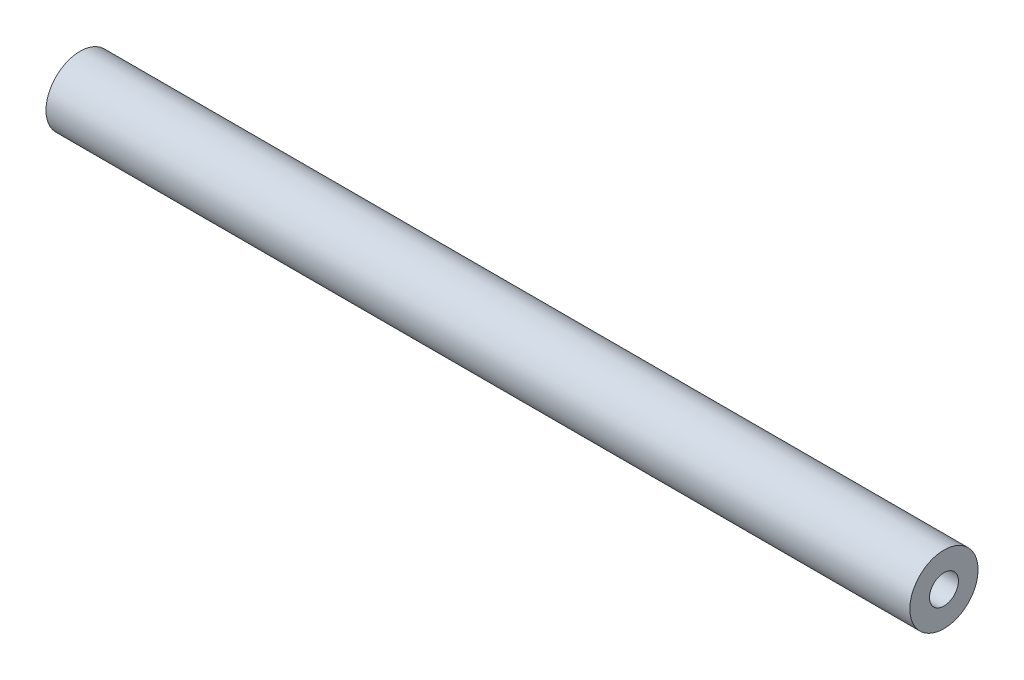
ISO-10303-21;
HEADER;
FILE_DESCRIPTION(('STEP AP214'),'2;1');
FILE_NAME('part.step','',(''),(''),'','','');
FILE_SCHEMA(('AUTOMOTIVE_DESIGN { 1 0 10303 214 1 1 1 1 }'));
ENDSEC;
DATA;
#1=APPLICATION_CONTEXT('core data for automotive mechanical design processes');
#2=APPLICATION_PROTOCOL_DEFINITION('international standard','automotive_design',2000,#1);
#3=PRODUCT_CONTEXT('',#1,'mechanical');
#4=PRODUCT('Part','Part','',(#3));
#5=PRODUCT_RELATED_PRODUCT_CATEGORY('part','',(#4));
#6=PRODUCT_DEFINITION_FORMATION('','',#4);
#7=PRODUCT_DEFINITION_CONTEXT('part definition',#1,'design');
#8=PRODUCT_DEFINITION('design','',#6,#7);
#9=PRODUCT_DEFINITION_SHAPE('','',#8);
#10=(LENGTH_UNIT() NAMED_UNIT(*) SI_UNIT(.MILLI.,.METRE.));
#11=(NAMED_UNIT(*) PLANE_ANGLE_UNIT() SI_UNIT($,.RADIAN.));
#12=(NAMED_UNIT(*) SI_UNIT($,.STERADIAN.) SOLID_ANGLE_UNIT());
#13=UNCERTAINTY_MEASURE_WITH_UNIT(LENGTH_MEASURE(1.E-05),#10,'distance_accuracy_value','');
#14=(GEOMETRIC_REPRESENTATION_CONTEXT(3) GLOBAL_UNCERTAINTY_ASSIGNED_CONTEXT((#13)) GLOBAL_UNIT_ASSIGNED_CONTEXT((#10,
#11,#12)) REPRESENTATION_CONTEXT('',''));
#15=CARTESIAN_POINT('',(0.,0.,0.));
#16=DIRECTION('',(0.,0.,1.));
#17=DIRECTION('',(1.,0.,0.));
#18=AXIS2_PLACEMENT_3D('',#15,#16,#17);
#19=CARTESIAN_POINT('',(60.325,0.,0.));
#20=DIRECTION('',(-1.,0.,0.));
#21=DIRECTION('',(0.,0.,1.));
#22=AXIS2_PLACEMENT_3D('',#19,#20,#21);
#23=CYLINDRICAL_SURFACE('',#22,4.7625);
#24=CARTESIAN_POINT('',(60.325,0.,0.));
#25=DIRECTION('',(1.,0.,0.));
#26=DIRECTION('',(0.,0.,-1.));
#27=AXIS2_PLACEMENT_3D('',#24,#25,#26);
#28=CIRCLE('',#27,4.7625);
#29=CARTESIAN_POINT('',(60.325,0.,4.7625));
#30=VERTEX_POINT('',#29);
#31=EDGE_CURVE('E11',#30,#30,#28,.T.);
#32=CARTESIAN_POINT('',(-60.325,0.,0.));
#33=DIRECTION('',(1.,0.,0.));
#34=DIRECTION('',(0.,0.,-1.));
#35=AXIS2_PLACEMENT_3D('',#32,#33,#34);
#36=CIRCLE('',#35,4.7625);
#37=CARTESIAN_POINT('',(-60.325,0.,4.7625));
#38=VERTEX_POINT('',#37);
#39=EDGE_CURVE('E48',#38,#38,#36,.T.);
#40=CARTESIAN_POINT('',(60.325,0.,4.7625));
#41=CARTESIAN_POINT('',(59.0682291666667,0.,4.7625));
#42=CARTESIAN_POINT('',(57.8114583333333,0.,4.7625));
#43=CARTESIAN_POINT('',(55.2979166666667,0.,4.7625));
#44=CARTESIAN_POINT('',(54.0411458333333,0.,4.7625));
#45=CARTESIAN_POINT('',(51.5276041666667,0.,4.7625));
#46=CARTESIAN_POINT('',(50.2708333333333,0.,4.7625));
#47=CARTESIAN_POINT('',(47.7572916666667,0.,4.7625));
#48=CARTESIAN_POINT('',(46.5005208333333,0.,4.7625));
#49=CARTESIAN_POINT('',(43.9869791666667,0.,4.7625));
#50=CARTESIAN_POINT('',(42.7302083333333,0.,4.7625));
#51=CARTESIAN_POINT('',(40.2166666666667,0.,4.7625));
#52=CARTESIAN_POINT('',(38.9598958333333,0.,4.7625));
#53=CARTESIAN_POINT('',(36.4463541666667,0.,4.7625));
#54=CARTESIAN_POINT('',(35.1895833333333,0.,4.7625));
#55=CARTESIAN_POINT('',(32.6760416666667,0.,4.7625));
#56=CARTESIAN_POINT('',(31.4192708333333,0.,4.7625));
#57=CARTESIAN_POINT('',(28.9057291666667,0.,4.7625));
#58=CARTESIAN_POINT('',(27.6489583333333,0.,4.7625));
#59=CARTESIAN_POINT('',(25.1354166666667,0.,4.7625));
#60=CARTESIAN_POINT('',(23.8786458333333,0.,4.7625));
#61=CARTESIAN_POINT('',(21.3651041666667,0.,4.7625));
#62=CARTESIAN_POINT('',(20.1083333333333,0.,4.7625));
#63=CARTESIAN_POINT('',(17.5947916666667,0.,4.7625));
#64=CARTESIAN_POINT('',(16.3380208333333,0.,4.7625));
#65=CARTESIAN_POINT('',(13.8244791666667,0.,4.7625));
#66=CARTESIAN_POINT('',(12.5677083333333,0.,4.7625));
#67=CARTESIAN_POINT('',(10.0541666666667,0.,4.7625));
#68=CARTESIAN_POINT('',(8.79739583333333,0.,4.7625));
#69=CARTESIAN_POINT('',(6.28385416666666,0.,4.7625));
#70=CARTESIAN_POINT('',(5.02708333333333,0.,4.7625));
#71=CARTESIAN_POINT('',(2.51354166666666,0.,4.7625));
#72=CARTESIAN_POINT('',(1.25677083333333,0.,4.7625));
#73=CARTESIAN_POINT('',(-1.25677083333333,0.,4.7625));
#74=CARTESIAN_POINT('',(-2.51354166666666,0.,4.7625));
#75=CARTESIAN_POINT('',(-5.02708333333332,0.,4.7625));
#76=CARTESIAN_POINT('',(-6.28385416666666,0.,4.7625));
#77=CARTESIAN_POINT('',(-8.79739583333333,0.,4.7625));
#78=CARTESIAN_POINT('',(-10.0541666666667,0.,4.7625));
#79=CARTESIAN_POINT('',(-12.5677083333333,0.,4.7625));
#80=CARTESIAN_POINT('',(-13.8244791666667,0.,4.7625));
#81=CARTESIAN_POINT('',(-16.3380208333333,0.,4.7625));
#82=CARTESIAN_POINT('',(-17.5947916666667,0.,4.7625));
#83=CARTESIAN_POINT('',(-20.1083333333333,0.,4.7625));
#84=CARTESIAN_POINT('',(-21.3651041666667,0.,4.7625));
#85=CARTESIAN_POINT('',(-23.8786458333333,0.,4.7625));
#86=CARTESIAN_POINT('',(-25.1354166666667,0.,4.7625));
#87=CARTESIAN_POINT('',(-27.6489583333333,0.,4.7625));
#88=CARTESIAN_POINT('',(-28.9057291666667,0.,4.7625));
#89=CARTESIAN_POINT('',(-31.4192708333333,0.,4.7625));
#90=CARTESIAN_POINT('',(-32.6760416666667,0.,4.7625));
#91=CARTESIAN_POINT('',(-35.1895833333333,0.,4.7625));
#92=CARTESIAN_POINT('',(-36.4463541666667,0.,4.7625));
#93=CARTESIAN_POINT('',(-38.9598958333333,0.,4.7625));
#94=CARTESIAN_POINT('',(-40.2166666666667,0.,4.7625));
#95=CARTESIAN_POINT('',(-42.7302083333333,0.,4.7625));
#96=CARTESIAN_POINT('',(-43.9869791666667,0.,4.7625));
#97=CARTESIAN_POINT('',(-46.5005208333333,0.,4.7625));
#98=CARTESIAN_POINT('',(-47.7572916666667,0.,4.7625));
#99=CARTESIAN_POINT('',(-50.2708333333333,0.,4.7625));
#100=CARTESIAN_POINT('',(-51.5276041666667,0.,4.7625));
#101=CARTESIAN_POINT('',(-54.0411458333333,0.,4.7625));
#102=CARTESIAN_POINT('',(-55.2979166666667,0.,4.7625));
#103=CARTESIAN_POINT('',(-57.8114583333333,0.,4.7625));
#104=CARTESIAN_POINT('',(-59.0682291666667,0.,4.7625));
#105=CARTESIAN_POINT('',(-60.325,0.,4.7625));
#106=B_SPLINE_CURVE_WITH_KNOTS('',3,(#40,#41,#42,#43,#44,#45,#46,#47,#48,#49,#50,#51,#52,#53,
#54,#55,#56,#57,#58,#59,#60,#61,#62,#63,#64,#65,#66,#67,#68,#69,#70,#71,#72,#73,#74,#75,#76,#77,
#78,#79,#80,#81,#82,#83,#84,#85,#86,#87,#88,#89,#90,#91,#92,#93,#94,#95,#96,#97,#98,#99,#100,
#101,#102,#103,#104,#105),.UNSPECIFIED.,.F.,.F.,(4,2,2,2,2,2,2,2,2,2,2,2,2,2,2,2,2,2,2,2,2,2,2,
2,2,2,2,2,2,2,2,2,4),(0.,3.7703125,7.540625,11.3109375,15.08125,18.8515625,22.621875,26.3921875,
30.1625,33.9328125,37.703125,41.4734375,45.24375,49.0140625,52.784375,56.5546875,60.325,
64.0953125,67.865625,71.6359375,75.40625,79.1765625,82.946875,86.7171875,90.4875,94.2578125,
98.028125,101.7984375,105.56875,109.3390625,113.109375,116.8796875,120.65),.UNSPECIFIED.);
#107=EDGE_CURVE('BSEAM45',#30,#38,#106,.T.);
#108=ORIENTED_EDGE('',*,*,#31,.F.);
#109=ORIENTED_EDGE('',*,*,#39,.T.);
#110=ORIENTED_EDGE('',*,*,#107,.T.);
#111=ORIENTED_EDGE('',*,*,#107,.F.);
#112=EDGE_LOOP('',(#108,#110,#109,#111));
#113=FACE_BOUND('',#112,.T.);
#114=ADVANCED_FACE('F45',(#113),#23,.T.);
#115=CARTESIAN_POINT('',(60.325,0.,0.));
#116=DIRECTION('',(1.,0.,0.));
#117=DIRECTION('',(0.,0.,-1.));
#118=AXIS2_PLACEMENT_3D('',#115,#116,#117);
#119=PLANE('',#118);
#120=CARTESIAN_POINT('',(60.325,0.,0.));
#121=DIRECTION('',(1.,0.,0.));
#122=DIRECTION('',(0.,0.,-1.));
#123=AXIS2_PLACEMENT_3D('',#120,#121,#122);
#124=CIRCLE('',#123,2.01929999999999);
#125=CARTESIAN_POINT('',(60.325,0.,-2.01929999999999));
#126=VERTEX_POINT('',#125);
#127=EDGE_CURVE('E69',#126,#126,#124,.T.);
#128=ORIENTED_EDGE('',*,*,#127,.F.);
#129=EDGE_LOOP('',(#128));
#130=FACE_BOUND('',#129,.T.);
#131=ORIENTED_EDGE('',*,*,#31,.T.);
#132=EDGE_LOOP('',(#131));
#133=FACE_BOUND('',#132,.T.);
#134=ADVANCED_FACE('F87',(#130,#133),#119,.T.);
#135=CARTESIAN_POINT('',(-60.325,0.,0.));
#136=DIRECTION('',(1.,0.,0.));
#137=DIRECTION('',(0.,0.,-1.));
#138=AXIS2_PLACEMENT_3D('',#135,#136,#137);
#139=PLANE('',#138);
#140=CARTESIAN_POINT('',(-60.325,0.,0.));
#141=DIRECTION('',(-1.,0.,0.));
#142=DIRECTION('',(0.,0.,1.));
#143=AXIS2_PLACEMENT_3D('',#140,#141,#142);
#144=CIRCLE('',#143,2.01929999999999);
#145=CARTESIAN_POINT('',(-60.325,0.,2.01929999999999));
#146=VERTEX_POINT('',#145);
#147=EDGE_CURVE('E68',#146,#146,#144,.T.);
#148=ORIENTED_EDGE('',*,*,#147,.F.);
#149=EDGE_LOOP('',(#148));
#150=FACE_BOUND('',#149,.T.);
#151=ORIENTED_EDGE('',*,*,#39,.F.);
#152=EDGE_LOOP('',(#151));
#153=FACE_BOUND('',#152,.T.);
#154=ADVANCED_FACE('F84',(#150,#153),#139,.F.);
#155=CARTESIAN_POINT('',(-44.069,0.,0.));
#156=DIRECTION('',(-1.,0.,0.));
#157=DIRECTION('',(0.,0.,1.));
#158=AXIS2_PLACEMENT_3D('',#155,#156,#157);
#159=CONICAL_SURFACE('',#158,2.01929999999999,1.02974425867665);
#160=CARTESIAN_POINT('',(-42.8556821519976,0.,0.));
#161=VERTEX_POINT('',#160);
#162=VERTEX_LOOP('',#161);
#163=FACE_BOUND('',#162,.T.);
#164=CARTESIAN_POINT('',(-44.069,0.,0.));
#165=DIRECTION('',(-1.,0.,0.));
#166=DIRECTION('',(0.,0.,1.));
#167=AXIS2_PLACEMENT_3D('',#164,#165,#166);
#168=CIRCLE('',#167,2.01929999999999);
#169=CARTESIAN_POINT('',(-44.069,0.,2.01929999999999));
#170=VERTEX_POINT('',#169);
#171=EDGE_CURVE('E72',#170,#170,#168,.T.);
#172=ORIENTED_EDGE('',*,*,#171,.T.);
#173=EDGE_LOOP('',(#172));
#174=FACE_BOUND('',#173,.T.);
#175=ADVANCED_FACE('F86',(#163,#174),#159,.F.);
#176=CARTESIAN_POINT('',(-60.325,0.,0.));
#177=DIRECTION('',(-1.,0.,0.));
#178=DIRECTION('',(0.,0.,1.));
#179=AXIS2_PLACEMENT_3D('',#176,#177,#178);
#180=CYLINDRICAL_SURFACE('',#179,2.01929999999999);
#181=ORIENTED_EDGE('',*,*,#171,.F.);
#182=EDGE_LOOP('',(#181));
#183=FACE_BOUND('',#182,.T.);
#184=ORIENTED_EDGE('',*,*,#147,.T.);
#185=EDGE_LOOP('',(#184));
#186=FACE_BOUND('',#185,.T.);
#187=ADVANCED_FACE('F62',(#183,#186),#180,.F.);
#188=CARTESIAN_POINT('',(44.069,0.,0.));
#189=DIRECTION('',(1.,0.,0.));
#190=DIRECTION('',(0.,0.,-1.));
#191=AXIS2_PLACEMENT_3D('',#188,#189,#190);
#192=CONICAL_SURFACE('',#191,2.01929999999999,1.02974425867665);
#193=CARTESIAN_POINT('',(42.8556821519976,0.,0.));
#194=VERTEX_POINT('',#193);
#195=VERTEX_LOOP('',#194);
#196=FACE_BOUND('',#195,.T.);
#197=CARTESIAN_POINT('',(44.069,0.,0.));
#198=DIRECTION('',(1.,0.,0.));
#199=DIRECTION('',(0.,0.,-1.));
#200=AXIS2_PLACEMENT_3D('',#197,#198,#199);
#201=CIRCLE('',#200,2.01929999999999);
#202=CARTESIAN_POINT('',(44.069,0.,-2.01929999999999));
#203=VERTEX_POINT('',#202);
#204=EDGE_CURVE('E66',#203,#203,#201,.T.);
#205=ORIENTED_EDGE('',*,*,#204,.T.);
#206=EDGE_LOOP('',(#205));
#207=FACE_BOUND('',#206,.T.);
#208=ADVANCED_FACE('F58',(#196,#207),#192,.F.);
#209=CARTESIAN_POINT('',(60.325,0.,0.));
#210=DIRECTION('',(1.,0.,0.));
#211=DIRECTION('',(0.,0.,-1.));
#212=AXIS2_PLACEMENT_3D('',#209,#210,#211);
#213=CYLINDRICAL_SURFACE('',#212,2.01929999999999);
#214=ORIENTED_EDGE('',*,*,#204,.F.);
#215=EDGE_LOOP('',(#214));
#216=FACE_BOUND('',#215,.T.);
#217=ORIENTED_EDGE('',*,*,#127,.T.);
#218=EDGE_LOOP('',(#217));
#219=FACE_BOUND('',#218,.T.);
#220=ADVANCED_FACE('F61',(#216,#219),#213,.F.);
#221=CLOSED_SHELL('',(#114,#134,#154,#175,#187,#208,#220));
#222=MANIFOLD_SOLID_BREP('B2',#221);
#223=ADVANCED_BREP_SHAPE_REPRESENTATION('',(#18,#222),#14);
#224=SHAPE_DEFINITION_REPRESENTATION(#9,#223);
ENDSEC;
END-ISO-10303-21;
